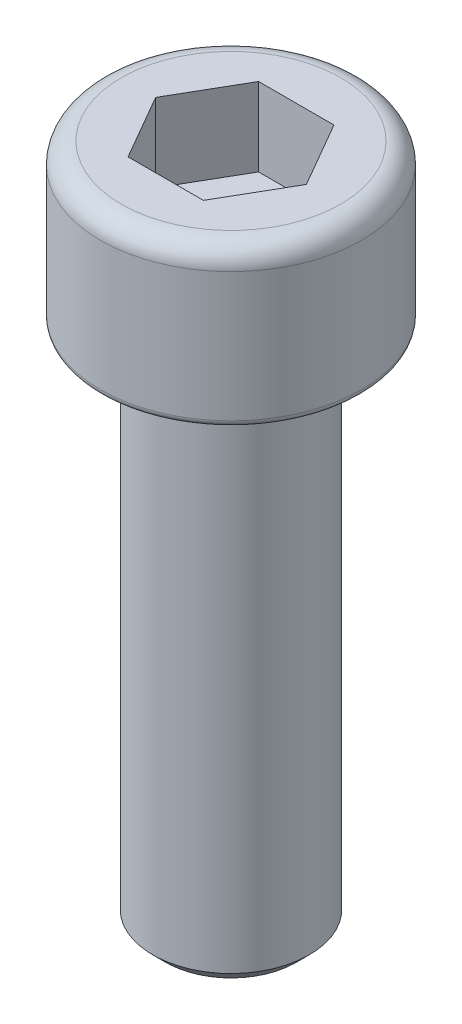
ISO-10303-21;
HEADER;
FILE_DESCRIPTION(('STEP AP214'),'2;1');
FILE_NAME('part.step','',(''),(''),'','','');
FILE_SCHEMA(('AUTOMOTIVE_DESIGN { 1 0 10303 214 1 1 1 1 }'));
ENDSEC;
DATA;
#1=APPLICATION_CONTEXT('core data for automotive mechanical design processes');
#2=APPLICATION_PROTOCOL_DEFINITION('international standard','automotive_design',2000,#1);
#3=PRODUCT_CONTEXT('',#1,'mechanical');
#4=PRODUCT('Part','Part','',(#3));
#5=PRODUCT_RELATED_PRODUCT_CATEGORY('part','',(#4));
#6=PRODUCT_DEFINITION_FORMATION('','',#4);
#7=PRODUCT_DEFINITION_CONTEXT('part definition',#1,'design');
#8=PRODUCT_DEFINITION('design','',#6,#7);
#9=PRODUCT_DEFINITION_SHAPE('','',#8);
#10=(LENGTH_UNIT() NAMED_UNIT(*) SI_UNIT(.MILLI.,.METRE.));
#11=(NAMED_UNIT(*) PLANE_ANGLE_UNIT() SI_UNIT($,.RADIAN.));
#12=(NAMED_UNIT(*) SI_UNIT($,.STERADIAN.) SOLID_ANGLE_UNIT());
#13=UNCERTAINTY_MEASURE_WITH_UNIT(LENGTH_MEASURE(1.E-05),#10,'distance_accuracy_value','');
#14=(GEOMETRIC_REPRESENTATION_CONTEXT(3) GLOBAL_UNCERTAINTY_ASSIGNED_CONTEXT((#13)) GLOBAL_UNIT_ASSIGNED_CONTEXT((#10,
#11,#12)) REPRESENTATION_CONTEXT('',''));
#15=CARTESIAN_POINT('',(0.,0.,0.));
#16=DIRECTION('',(0.,0.,1.));
#17=DIRECTION('',(1.,0.,0.));
#18=AXIS2_PLACEMENT_3D('',#15,#16,#17);
#19=CARTESIAN_POINT('',(0.,0.,0.));
#20=DIRECTION('',(0.,1.,0.));
#21=DIRECTION('',(0.,0.,1.));
#22=AXIS2_PLACEMENT_3D('',#19,#20,#21);
#23=PLANE('',#22);
#24=CARTESIAN_POINT('',(0.,0.,0.));
#25=DIRECTION('',(0.,1.,0.));
#26=DIRECTION('',(0.,0.,1.));
#27=AXIS2_PLACEMENT_3D('',#24,#25,#26);
#28=CIRCLE('',#27,4.2);
#29=CARTESIAN_POINT('',(0.,0.,4.2));
#30=VERTEX_POINT('',#29);
#31=EDGE_CURVE('E159',#30,#30,#28,.T.);
#32=ORIENTED_EDGE('',*,*,#31,.T.);
#33=EDGE_LOOP('',(#32));
#34=FACE_BOUND('',#33,.T.);
#35=DIRECTION('',(0.5,0.,-0.866025403784439));
#36=VECTOR('',#35,1.);
#37=CARTESIAN_POINT('',(1.44337567297406,0.,2.5));
#38=LINE('',#37,#36);
#39=CARTESIAN_POINT('',(1.44337567297406,0.,2.5));
#40=VERTEX_POINT('',#39);
#41=CARTESIAN_POINT('',(2.88675134594813,0.,0.));
#42=VERTEX_POINT('',#41);
#43=EDGE_CURVE('E64',#40,#42,#38,.T.);
#44=ORIENTED_EDGE('',*,*,#43,.F.);
#45=DIRECTION('',(1.,0.,0.));
#46=VECTOR('',#45,1.);
#47=CARTESIAN_POINT('',(-1.44337567297406,0.,2.5));
#48=LINE('',#47,#46);
#49=CARTESIAN_POINT('',(-1.44337567297406,0.,2.5));
#50=VERTEX_POINT('',#49);
#51=EDGE_CURVE('E147',#50,#40,#48,.T.);
#52=ORIENTED_EDGE('',*,*,#51,.F.);
#53=DIRECTION('',(0.5,0.,0.866025403784438));
#54=VECTOR('',#53,1.);
#55=CARTESIAN_POINT('',(-2.88675134594813,0.,0.));
#56=LINE('',#55,#54);
#57=CARTESIAN_POINT('',(-2.88675134594813,0.,0.));
#58=VERTEX_POINT('',#57);
#59=EDGE_CURVE('E145',#58,#50,#56,.T.);
#60=ORIENTED_EDGE('',*,*,#59,.F.);
#61=DIRECTION('',(-0.5,0.,0.866025403784439));
#62=VECTOR('',#61,1.);
#63=CARTESIAN_POINT('',(-1.44337567297407,0.,-2.5));
#64=LINE('',#63,#62);
#65=CARTESIAN_POINT('',(-1.44337567297407,0.,-2.5));
#66=VERTEX_POINT('',#65);
#67=EDGE_CURVE('E112',#66,#58,#64,.T.);
#68=ORIENTED_EDGE('',*,*,#67,.F.);
#69=DIRECTION('',(-1.,0.,0.));
#70=VECTOR('',#69,1.);
#71=CARTESIAN_POINT('',(1.44337567297406,0.,-2.5));
#72=LINE('',#71,#70);
#73=CARTESIAN_POINT('',(1.44337567297406,0.,-2.5));
#74=VERTEX_POINT('',#73);
#75=EDGE_CURVE('E141',#74,#66,#72,.T.);
#76=ORIENTED_EDGE('',*,*,#75,.F.);
#77=DIRECTION('',(-0.5,0.,-0.866025403784438));
#78=VECTOR('',#77,1.);
#79=CARTESIAN_POINT('',(2.88675134594813,0.,0.));
#80=LINE('',#79,#78);
#81=EDGE_CURVE('E138',#42,#74,#80,.T.);
#82=ORIENTED_EDGE('',*,*,#81,.F.);
#83=EDGE_LOOP('',(#44,#52,#60,#68,#76,#82));
#84=FACE_BOUND('',#83,.T.);
#85=ADVANCED_FACE('F49',(#34,#84),#23,.T.);
#86=CARTESIAN_POINT('',(0.,-31.,0.));
#87=DIRECTION('',(0.,-1.,0.));
#88=DIRECTION('',(0.,0.,-1.));
#89=AXIS2_PLACEMENT_3D('',#86,#87,#88);
#90=CYLINDRICAL_SURFACE('',#89,5.);
#91=CARTESIAN_POINT('',(0.,-5.75,0.));
#92=DIRECTION('',(0.,-1.,0.));
#93=DIRECTION('',(0.,0.,-1.));
#94=AXIS2_PLACEMENT_3D('',#91,#92,#93);
#95=CIRCLE('',#94,5.);
#96=CARTESIAN_POINT('',(0.,-5.75,-5.));
#97=VERTEX_POINT('',#96);
#98=EDGE_CURVE('E11',#97,#97,#95,.F.);
#99=ORIENTED_EDGE('',*,*,#98,.T.);
#100=EDGE_LOOP('',(#99));
#101=FACE_BOUND('',#100,.T.);
#102=CARTESIAN_POINT('',(0.,-0.799999999999999,0.));
#103=DIRECTION('',(0.,1.,0.));
#104=DIRECTION('',(0.,0.,1.));
#105=AXIS2_PLACEMENT_3D('',#102,#103,#104);
#106=CIRCLE('',#105,5.);
#107=CARTESIAN_POINT('',(0.,-0.799999999999999,5.));
#108=VERTEX_POINT('',#107);
#109=EDGE_CURVE('E151',#108,#108,#106,.F.);
#110=ORIENTED_EDGE('',*,*,#109,.T.);
#111=EDGE_LOOP('',(#110));
#112=FACE_BOUND('',#111,.T.);
#113=ADVANCED_FACE('F208',(#101,#112),#90,.T.);
#114=CARTESIAN_POINT('',(5.,-6.,0.));
#115=DIRECTION('',(0.,-1.,0.));
#116=DIRECTION('',(0.,0.,-1.));
#117=AXIS2_PLACEMENT_3D('',#114,#115,#116);
#118=PLANE('',#117);
#119=CARTESIAN_POINT('',(0.,-6.,0.));
#120=DIRECTION('',(0.,-1.,0.));
#121=DIRECTION('',(0.,0.,-1.));
#122=AXIS2_PLACEMENT_3D('',#119,#120,#121);
#123=CIRCLE('',#122,3.25);
#124=CARTESIAN_POINT('',(0.,-6.,-3.25));
#125=VERTEX_POINT('',#124);
#126=EDGE_CURVE('E57',#125,#125,#123,.F.);
#127=ORIENTED_EDGE('',*,*,#126,.T.);
#128=EDGE_LOOP('',(#127));
#129=FACE_BOUND('',#128,.T.);
#130=CARTESIAN_POINT('',(0.,-6.,0.));
#131=DIRECTION('',(0.,-1.,0.));
#132=DIRECTION('',(0.,0.,-1.));
#133=AXIS2_PLACEMENT_3D('',#130,#131,#132);
#134=CIRCLE('',#133,4.75);
#135=CARTESIAN_POINT('',(0.,-6.,-4.75));
#136=VERTEX_POINT('',#135);
#137=EDGE_CURVE('E171',#136,#136,#134,.T.);
#138=ORIENTED_EDGE('',*,*,#137,.T.);
#139=EDGE_LOOP('',(#138));
#140=FACE_BOUND('',#139,.T.);
#141=ADVANCED_FACE('F176',(#129,#140),#118,.T.);
#142=CARTESIAN_POINT('',(0.,-31.,0.));
#143=DIRECTION('',(0.,-1.,0.));
#144=DIRECTION('',(0.,0.,-1.));
#145=AXIS2_PLACEMENT_3D('',#142,#143,#144);
#146=CYLINDRICAL_SURFACE('',#145,3.);
#147=CARTESIAN_POINT('',(0.,-6.25,0.));
#148=DIRECTION('',(0.,-1.,0.));
#149=DIRECTION('',(0.,0.,-1.));
#150=AXIS2_PLACEMENT_3D('',#147,#148,#149);
#151=CIRCLE('',#150,3.);
#152=CARTESIAN_POINT('',(0.,-6.25,-3.));
#153=VERTEX_POINT('',#152);
#154=EDGE_CURVE('E168',#153,#153,#151,.T.);
#155=ORIENTED_EDGE('',*,*,#154,.T.);
#156=EDGE_LOOP('',(#155));
#157=FACE_BOUND('',#156,.T.);
#158=CARTESIAN_POINT('',(0.,-25.5,0.));
#159=DIRECTION('',(0.,-1.,0.));
#160=DIRECTION('',(0.,0.,-1.));
#161=AXIS2_PLACEMENT_3D('',#158,#159,#160);
#162=CIRCLE('',#161,3.);
#163=CARTESIAN_POINT('',(0.,-25.5,-3.));
#164=VERTEX_POINT('',#163);
#165=EDGE_CURVE('E165',#164,#164,#162,.F.);
#166=ORIENTED_EDGE('',*,*,#165,.T.);
#167=EDGE_LOOP('',(#166));
#168=FACE_BOUND('',#167,.T.);
#169=ADVANCED_FACE('F185',(#157,#168),#146,.T.);
#170=CARTESIAN_POINT('',(3.,-26.,0.));
#171=DIRECTION('',(0.,-1.,0.));
#172=DIRECTION('',(0.,0.,-1.));
#173=AXIS2_PLACEMENT_3D('',#170,#171,#172);
#174=PLANE('',#173);
#175=CARTESIAN_POINT('',(0.,-26.,0.));
#176=DIRECTION('',(0.,-1.,0.));
#177=DIRECTION('',(0.,0.,-1.));
#178=AXIS2_PLACEMENT_3D('',#175,#176,#177);
#179=CIRCLE('',#178,2.49999999999999);
#180=CARTESIAN_POINT('',(0.,-26.,-2.49999999999999));
#181=VERTEX_POINT('',#180);
#182=EDGE_CURVE('E162',#181,#181,#179,.T.);
#183=ORIENTED_EDGE('',*,*,#182,.T.);
#184=EDGE_LOOP('',(#183));
#185=FACE_BOUND('',#184,.T.);
#186=ADVANCED_FACE('F188',(#185),#174,.T.);
#187=CARTESIAN_POINT('',(1.44337567297406,-3.,2.5));
#188=DIRECTION('',(0.866025403784439,0.,0.5));
#189=DIRECTION('',(0.5,0.,-0.866025403784439));
#190=AXIS2_PLACEMENT_3D('',#187,#188,#189);
#191=PLANE('',#190);
#192=ORIENTED_EDGE('',*,*,#43,.T.);
#193=DIRECTION('',(0.,1.,0.));
#194=VECTOR('',#193,1.);
#195=CARTESIAN_POINT('',(2.88675134594813,-3.,0.));
#196=LINE('',#195,#194);
#197=CARTESIAN_POINT('',(2.88675134594813,-3.,0.));
#198=VERTEX_POINT('',#197);
#199=EDGE_CURVE('E94',#198,#42,#196,.T.);
#200=ORIENTED_EDGE('',*,*,#199,.F.);
#201=DIRECTION('',(0.5,0.,-0.866025403784439));
#202=VECTOR('',#201,1.);
#203=CARTESIAN_POINT('',(1.44337567297406,-3.,2.5));
#204=LINE('',#203,#202);
#205=CARTESIAN_POINT('',(1.44337567297406,-3.,2.5));
#206=VERTEX_POINT('',#205);
#207=EDGE_CURVE('E149',#206,#198,#204,.T.);
#208=ORIENTED_EDGE('',*,*,#207,.F.);
#209=DIRECTION('',(0.,1.,0.));
#210=VECTOR('',#209,1.);
#211=CARTESIAN_POINT('',(1.44337567297406,-3.,2.5));
#212=LINE('',#211,#210);
#213=EDGE_CURVE('E72',#206,#40,#212,.T.);
#214=ORIENTED_EDGE('',*,*,#213,.T.);
#215=EDGE_LOOP('',(#192,#200,#208,#214));
#216=FACE_BOUND('',#215,.T.);
#217=ADVANCED_FACE('F199',(#216),#191,.F.);
#218=CARTESIAN_POINT('',(-1.44337567297406,-3.,2.5));
#219=DIRECTION('',(0.,0.,1.));
#220=DIRECTION('',(1.,0.,0.));
#221=AXIS2_PLACEMENT_3D('',#218,#219,#220);
#222=PLANE('',#221);
#223=ORIENTED_EDGE('',*,*,#51,.T.);
#224=ORIENTED_EDGE('',*,*,#213,.F.);
#225=DIRECTION('',(1.,0.,0.));
#226=VECTOR('',#225,1.);
#227=CARTESIAN_POINT('',(-1.44337567297406,-3.,2.5));
#228=LINE('',#227,#226);
#229=CARTESIAN_POINT('',(-1.44337567297406,-3.,2.5));
#230=VERTEX_POINT('',#229);
#231=EDGE_CURVE('E124',#230,#206,#228,.T.);
#232=ORIENTED_EDGE('',*,*,#231,.F.);
#233=DIRECTION('',(0.,1.,0.));
#234=VECTOR('',#233,1.);
#235=CARTESIAN_POINT('',(-1.44337567297406,-3.,2.5));
#236=LINE('',#235,#234);
#237=EDGE_CURVE('E116',#230,#50,#236,.T.);
#238=ORIENTED_EDGE('',*,*,#237,.T.);
#239=EDGE_LOOP('',(#223,#224,#232,#238));
#240=FACE_BOUND('',#239,.T.);
#241=ADVANCED_FACE('F205',(#240),#222,.F.);
#242=CARTESIAN_POINT('',(-2.88675134594813,-3.,0.));
#243=DIRECTION('',(-0.866025403784438,0.,0.5));
#244=DIRECTION('',(0.5,0.,0.866025403784438));
#245=AXIS2_PLACEMENT_3D('',#242,#243,#244);
#246=PLANE('',#245);
#247=ORIENTED_EDGE('',*,*,#59,.T.);
#248=ORIENTED_EDGE('',*,*,#237,.F.);
#249=DIRECTION('',(0.5,0.,0.866025403784438));
#250=VECTOR('',#249,1.);
#251=CARTESIAN_POINT('',(-2.88675134594813,-3.,0.));
#252=LINE('',#251,#250);
#253=CARTESIAN_POINT('',(-2.88675134594813,-3.,0.));
#254=VERTEX_POINT('',#253);
#255=EDGE_CURVE('E120',#254,#230,#252,.T.);
#256=ORIENTED_EDGE('',*,*,#255,.F.);
#257=DIRECTION('',(0.,1.,0.));
#258=VECTOR('',#257,1.);
#259=CARTESIAN_POINT('',(-2.88675134594813,-3.,0.));
#260=LINE('',#259,#258);
#261=EDGE_CURVE('E105',#254,#58,#260,.T.);
#262=ORIENTED_EDGE('',*,*,#261,.T.);
#263=EDGE_LOOP('',(#247,#248,#256,#262));
#264=FACE_BOUND('',#263,.T.);
#265=ADVANCED_FACE('F121',(#264),#246,.F.);
#266=CARTESIAN_POINT('',(-1.44337567297407,-3.,-2.5));
#267=DIRECTION('',(-0.866025403784439,0.,-0.5));
#268=DIRECTION('',(-0.5,0.,0.866025403784439));
#269=AXIS2_PLACEMENT_3D('',#266,#267,#268);
#270=PLANE('',#269);
#271=ORIENTED_EDGE('',*,*,#67,.T.);
#272=ORIENTED_EDGE('',*,*,#261,.F.);
#273=DIRECTION('',(-0.5,0.,0.866025403784439));
#274=VECTOR('',#273,1.);
#275=CARTESIAN_POINT('',(-1.44337567297407,-3.,-2.5));
#276=LINE('',#275,#274);
#277=CARTESIAN_POINT('',(-1.44337567297407,-3.,-2.5));
#278=VERTEX_POINT('',#277);
#279=EDGE_CURVE('E109',#278,#254,#276,.T.);
#280=ORIENTED_EDGE('',*,*,#279,.F.);
#281=DIRECTION('',(0.,1.,0.));
#282=VECTOR('',#281,1.);
#283=CARTESIAN_POINT('',(-1.44337567297407,-3.,-2.5));
#284=LINE('',#283,#282);
#285=EDGE_CURVE('E117',#278,#66,#284,.T.);
#286=ORIENTED_EDGE('',*,*,#285,.T.);
#287=EDGE_LOOP('',(#271,#272,#280,#286));
#288=FACE_BOUND('',#287,.T.);
#289=ADVANCED_FACE('F107',(#288),#270,.F.);
#290=CARTESIAN_POINT('',(1.44337567297406,-3.,-2.5));
#291=DIRECTION('',(0.,0.,-1.));
#292=DIRECTION('',(-1.,0.,0.));
#293=AXIS2_PLACEMENT_3D('',#290,#291,#292);
#294=PLANE('',#293);
#295=ORIENTED_EDGE('',*,*,#75,.T.);
#296=ORIENTED_EDGE('',*,*,#285,.F.);
#297=DIRECTION('',(-1.,0.,0.));
#298=VECTOR('',#297,1.);
#299=CARTESIAN_POINT('',(1.44337567297406,-3.,-2.5));
#300=LINE('',#299,#298);
#301=CARTESIAN_POINT('',(1.44337567297406,-3.,-2.5));
#302=VERTEX_POINT('',#301);
#303=EDGE_CURVE('E130',#302,#278,#300,.T.);
#304=ORIENTED_EDGE('',*,*,#303,.F.);
#305=DIRECTION('',(0.,1.,0.));
#306=VECTOR('',#305,1.);
#307=CARTESIAN_POINT('',(1.44337567297406,-3.,-2.5));
#308=LINE('',#307,#306);
#309=EDGE_CURVE('E154',#302,#74,#308,.T.);
#310=ORIENTED_EDGE('',*,*,#309,.T.);
#311=EDGE_LOOP('',(#295,#296,#304,#310));
#312=FACE_BOUND('',#311,.T.);
#313=ADVANCED_FACE('F236',(#312),#294,.F.);
#314=CARTESIAN_POINT('',(2.88675134594813,-3.,0.));
#315=DIRECTION('',(0.866025403784438,0.,-0.5));
#316=DIRECTION('',(-0.5,0.,-0.866025403784438));
#317=AXIS2_PLACEMENT_3D('',#314,#315,#316);
#318=PLANE('',#317);
#319=ORIENTED_EDGE('',*,*,#81,.T.);
#320=ORIENTED_EDGE('',*,*,#309,.F.);
#321=DIRECTION('',(-0.5,0.,-0.866025403784438));
#322=VECTOR('',#321,1.);
#323=CARTESIAN_POINT('',(2.88675134594813,-3.,0.));
#324=LINE('',#323,#322);
#325=EDGE_CURVE('E132',#198,#302,#324,.T.);
#326=ORIENTED_EDGE('',*,*,#325,.F.);
#327=ORIENTED_EDGE('',*,*,#199,.T.);
#328=EDGE_LOOP('',(#319,#320,#326,#327));
#329=FACE_BOUND('',#328,.T.);
#330=ADVANCED_FACE('F227',(#329),#318,.F.);
#331=CARTESIAN_POINT('',(0.,-3.,0.));
#332=DIRECTION('',(0.,1.,0.));
#333=DIRECTION('',(0.,0.,1.));
#334=AXIS2_PLACEMENT_3D('',#331,#332,#333);
#335=PLANE('',#334);
#336=ORIENTED_EDGE('',*,*,#207,.T.);
#337=ORIENTED_EDGE('',*,*,#325,.T.);
#338=ORIENTED_EDGE('',*,*,#303,.T.);
#339=ORIENTED_EDGE('',*,*,#279,.T.);
#340=ORIENTED_EDGE('',*,*,#255,.T.);
#341=ORIENTED_EDGE('',*,*,#231,.T.);
#342=EDGE_LOOP('',(#336,#337,#338,#339,#340,#341));
#343=FACE_BOUND('',#342,.T.);
#344=ADVANCED_FACE('F127',(#343),#335,.T.);
#345=CARTESIAN_POINT('',(0.,-0.799999999999999,0.));
#346=DIRECTION('',(0.,1.,0.));
#347=DIRECTION('',(0.,0.,1.));
#348=AXIS2_PLACEMENT_3D('',#345,#346,#347);
#349=TOROIDAL_SURFACE('',#348,4.2,0.8);
#350=ORIENTED_EDGE('',*,*,#31,.F.);
#351=EDGE_LOOP('',(#350));
#352=FACE_BOUND('',#351,.T.);
#353=ORIENTED_EDGE('',*,*,#109,.F.);
#354=EDGE_LOOP('',(#353));
#355=FACE_BOUND('',#354,.T.);
#356=ADVANCED_FACE('F194',(#352,#355),#349,.T.);
#357=CARTESIAN_POINT('',(0.,-26.,0.));
#358=DIRECTION('',(0.,1.,0.));
#359=DIRECTION('',(0.,0.,1.));
#360=AXIS2_PLACEMENT_3D('',#357,#358,#359);
#361=CONICAL_SURFACE('',#360,2.49999999999999,0.78539816339745);
#362=ORIENTED_EDGE('',*,*,#165,.F.);
#363=EDGE_LOOP('',(#362));
#364=FACE_BOUND('',#363,.T.);
#365=ORIENTED_EDGE('',*,*,#182,.F.);
#366=EDGE_LOOP('',(#365));
#367=FACE_BOUND('',#366,.T.);
#368=ADVANCED_FACE('F182',(#364,#367),#361,.T.);
#369=CARTESIAN_POINT('',(0.,-6.25,0.));
#370=DIRECTION('',(0.,-1.,0.));
#371=DIRECTION('',(0.,0.,-1.));
#372=AXIS2_PLACEMENT_3D('',#369,#370,#371);
#373=TOROIDAL_SURFACE('',#372,3.25,0.25);
#374=ORIENTED_EDGE('',*,*,#126,.F.);
#375=EDGE_LOOP('',(#374));
#376=FACE_BOUND('',#375,.T.);
#377=ORIENTED_EDGE('',*,*,#154,.F.);
#378=EDGE_LOOP('',(#377));
#379=FACE_BOUND('',#378,.T.);
#380=ADVANCED_FACE('F179',(#376,#379),#373,.F.);
#381=CARTESIAN_POINT('',(0.,-5.75,0.));
#382=DIRECTION('',(0.,-1.,0.));
#383=DIRECTION('',(0.,0.,-1.));
#384=AXIS2_PLACEMENT_3D('',#381,#382,#383);
#385=TOROIDAL_SURFACE('',#384,4.75,0.25);
#386=ORIENTED_EDGE('',*,*,#98,.F.);
#387=EDGE_LOOP('',(#386));
#388=FACE_BOUND('',#387,.T.);
#389=ORIENTED_EDGE('',*,*,#137,.F.);
#390=EDGE_LOOP('',(#389));
#391=FACE_BOUND('',#390,.T.);
#392=ADVANCED_FACE('F51',(#388,#391),#385,.T.);
#393=CLOSED_SHELL('',(#85,#113,#141,#169,#186,#217,#241,#265,#289,#313,#330,#344,#356,#368,#380,#392));
#394=MANIFOLD_SOLID_BREP('B2',#393);
#395=ADVANCED_BREP_SHAPE_REPRESENTATION('',(#18,#394),#14);
#396=SHAPE_DEFINITION_REPRESENTATION(#9,#395);
ENDSEC;
END-ISO-10303-21;
